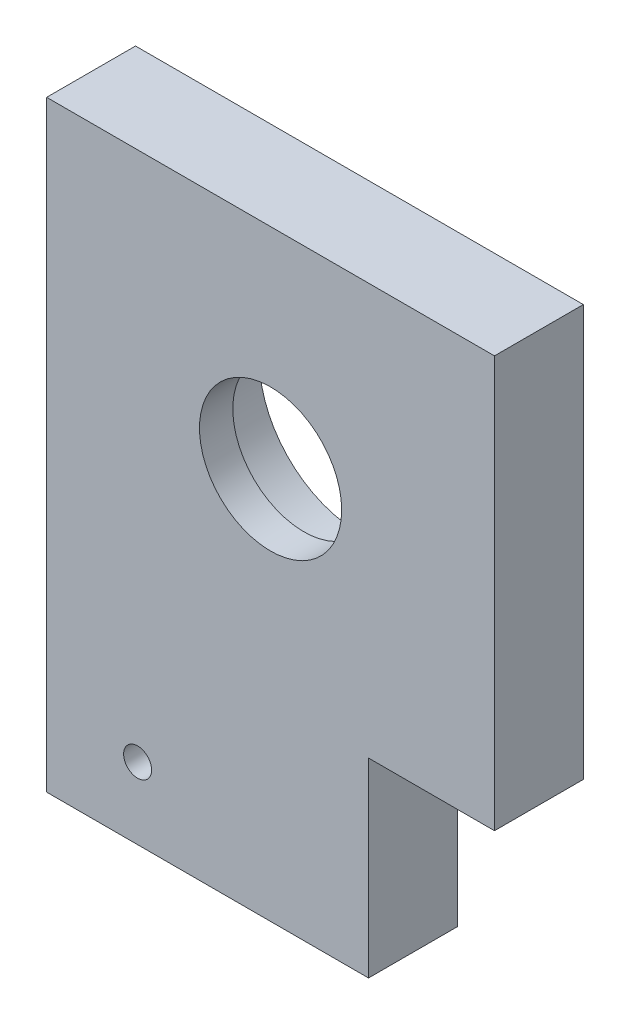
ISO-10303-21;
HEADER;
FILE_DESCRIPTION(('STEP AP214'),'2;1');
FILE_NAME('part.step','',(''),(''),'','','');
FILE_SCHEMA(('AUTOMOTIVE_DESIGN { 1 0 10303 214 1 1 1 1 }'));
ENDSEC;
DATA;
#1=APPLICATION_CONTEXT('core data for automotive mechanical design processes');
#2=APPLICATION_PROTOCOL_DEFINITION('international standard','automotive_design',2000,#1);
#3=PRODUCT_CONTEXT('',#1,'mechanical');
#4=PRODUCT('Part','Part','',(#3));
#5=PRODUCT_RELATED_PRODUCT_CATEGORY('part','',(#4));
#6=PRODUCT_DEFINITION_FORMATION('','',#4);
#7=PRODUCT_DEFINITION_CONTEXT('part definition',#1,'design');
#8=PRODUCT_DEFINITION('design','',#6,#7);
#9=PRODUCT_DEFINITION_SHAPE('','',#8);
#10=(LENGTH_UNIT() NAMED_UNIT(*) SI_UNIT(.MILLI.,.METRE.));
#11=(NAMED_UNIT(*) PLANE_ANGLE_UNIT() SI_UNIT($,.RADIAN.));
#12=(NAMED_UNIT(*) SI_UNIT($,.STERADIAN.) SOLID_ANGLE_UNIT());
#13=UNCERTAINTY_MEASURE_WITH_UNIT(LENGTH_MEASURE(1.E-05),#10,'distance_accuracy_value','');
#14=(GEOMETRIC_REPRESENTATION_CONTEXT(3) GLOBAL_UNCERTAINTY_ASSIGNED_CONTEXT((#13)) GLOBAL_UNIT_ASSIGNED_CONTEXT((#10,
#11,#12)) REPRESENTATION_CONTEXT('',''));
#15=CARTESIAN_POINT('',(0.,0.,0.));
#16=DIRECTION('',(0.,0.,1.));
#17=DIRECTION('',(1.,0.,0.));
#18=AXIS2_PLACEMENT_3D('',#15,#16,#17);
#19=CARTESIAN_POINT('',(0.,0.,12.7));
#20=DIRECTION('',(0.,0.,1.));
#21=DIRECTION('',(1.,0.,0.));
#22=AXIS2_PLACEMENT_3D('',#19,#20,#21);
#23=PLANE('',#22);
#24=CARTESIAN_POINT('',(0.,0.,12.7));
#25=DIRECTION('',(0.,0.,1.));
#26=DIRECTION('',(1.,0.,0.));
#27=AXIS2_PLACEMENT_3D('',#24,#25,#26);
#28=CIRCLE('',#27,10.16);
#29=CARTESIAN_POINT('',(10.16,0.,12.7));
#30=VERTEX_POINT('',#29);
#31=EDGE_CURVE('E121',#30,#30,#28,.T.);
#32=ORIENTED_EDGE('',*,*,#31,.F.);
#33=EDGE_LOOP('',(#32));
#34=FACE_BOUND('',#33,.T.);
#35=DIRECTION('',(1.,0.,0.));
#36=VECTOR('',#35,1.);
#37=CARTESIAN_POINT('',(14.,-28.7749891398763,12.7));
#38=LINE('',#37,#36);
#39=CARTESIAN_POINT('',(14.,-28.7749891398763,12.7));
#40=VERTEX_POINT('',#39);
#41=CARTESIAN_POINT('',(32.,-28.7749891398763,12.7));
#42=VERTEX_POINT('',#41);
#43=EDGE_CURVE('E129',#40,#42,#38,.T.);
#44=ORIENTED_EDGE('',*,*,#43,.T.);
#45=DIRECTION('',(0.,1.,0.));
#46=VECTOR('',#45,1.);
#47=CARTESIAN_POINT('',(32.,-28.7749891398763,12.7));
#48=LINE('',#47,#46);
#49=CARTESIAN_POINT('',(32.,30.,12.7));
#50=VERTEX_POINT('',#49);
#51=EDGE_CURVE('E87',#42,#50,#48,.T.);
#52=ORIENTED_EDGE('',*,*,#51,.T.);
#53=DIRECTION('',(-1.,0.,0.));
#54=VECTOR('',#53,1.);
#55=CARTESIAN_POINT('',(32.,30.,12.7));
#56=LINE('',#55,#54);
#57=CARTESIAN_POINT('',(-32.,30.,12.7));
#58=VERTEX_POINT('',#57);
#59=EDGE_CURVE('E100',#50,#58,#56,.T.);
#60=ORIENTED_EDGE('',*,*,#59,.T.);
#61=DIRECTION('',(0.,-1.,0.));
#62=VECTOR('',#61,1.);
#63=CARTESIAN_POINT('',(-32.,30.,12.7));
#64=LINE('',#63,#62);
#65=CARTESIAN_POINT('',(-32.,-56.,12.7));
#66=VERTEX_POINT('',#65);
#67=EDGE_CURVE('E94',#58,#66,#64,.T.);
#68=ORIENTED_EDGE('',*,*,#67,.T.);
#69=DIRECTION('',(1.,0.,0.));
#70=VECTOR('',#69,1.);
#71=CARTESIAN_POINT('',(14.,-56.,12.7));
#72=LINE('',#71,#70);
#73=CARTESIAN_POINT('',(14.,-56.,12.7));
#74=VERTEX_POINT('',#73);
#75=EDGE_CURVE('E98',#66,#74,#72,.T.);
#76=ORIENTED_EDGE('',*,*,#75,.T.);
#77=DIRECTION('',(0.,1.,0.));
#78=VECTOR('',#77,1.);
#79=CARTESIAN_POINT('',(14.,-56.,12.7));
#80=LINE('',#79,#78);
#81=EDGE_CURVE('E50',#74,#40,#80,.T.);
#82=ORIENTED_EDGE('',*,*,#81,.T.);
#83=EDGE_LOOP('',(#44,#52,#60,#68,#76,#82));
#84=FACE_BOUND('',#83,.T.);
#85=CARTESIAN_POINT('',(-19.,-45.7749891398763,12.7));
#86=DIRECTION('',(0.,0.,1.));
#87=DIRECTION('',(1.,0.,0.));
#88=AXIS2_PLACEMENT_3D('',#85,#86,#87);
#89=CIRCLE('',#88,2.);
#90=CARTESIAN_POINT('',(-17.,-45.7749891398763,12.7));
#91=VERTEX_POINT('',#90);
#92=EDGE_CURVE('E190',#91,#91,#89,.T.);
#93=ORIENTED_EDGE('',*,*,#92,.F.);
#94=EDGE_LOOP('',(#93));
#95=FACE_BOUND('',#94,.T.);
#96=ADVANCED_FACE('F32',(#34,#84,#95),#23,.T.);
#97=CARTESIAN_POINT('',(0.,0.,0.));
#98=DIRECTION('',(0.,0.,1.));
#99=DIRECTION('',(1.,0.,0.));
#100=AXIS2_PLACEMENT_3D('',#97,#98,#99);
#101=PLANE('',#100);
#102=CARTESIAN_POINT('',(0.,0.,0.));
#103=DIRECTION('',(0.,0.,1.));
#104=DIRECTION('',(1.,0.,0.));
#105=AXIS2_PLACEMENT_3D('',#102,#103,#104);
#106=CIRCLE('',#105,14.2875);
#107=CARTESIAN_POINT('',(14.2875,0.,0.));
#108=VERTEX_POINT('',#107);
#109=EDGE_CURVE('E184',#108,#108,#106,.T.);
#110=ORIENTED_EDGE('',*,*,#109,.T.);
#111=EDGE_LOOP('',(#110));
#112=FACE_BOUND('',#111,.T.);
#113=DIRECTION('',(1.,0.,0.));
#114=VECTOR('',#113,1.);
#115=CARTESIAN_POINT('',(14.,-28.7749891398763,0.));
#116=LINE('',#115,#114);
#117=CARTESIAN_POINT('',(14.,-28.7749891398763,0.));
#118=VERTEX_POINT('',#117);
#119=CARTESIAN_POINT('',(32.,-28.7749891398763,0.));
#120=VERTEX_POINT('',#119);
#121=EDGE_CURVE('E117',#118,#120,#116,.T.);
#122=ORIENTED_EDGE('',*,*,#121,.F.);
#123=DIRECTION('',(0.,1.,0.));
#124=VECTOR('',#123,1.);
#125=CARTESIAN_POINT('',(14.,-56.,0.));
#126=LINE('',#125,#124);
#127=CARTESIAN_POINT('',(14.,-56.,0.));
#128=VERTEX_POINT('',#127);
#129=EDGE_CURVE('E79',#128,#118,#126,.T.);
#130=ORIENTED_EDGE('',*,*,#129,.F.);
#131=DIRECTION('',(1.,0.,0.));
#132=VECTOR('',#131,1.);
#133=CARTESIAN_POINT('',(14.,-56.,0.));
#134=LINE('',#133,#132);
#135=CARTESIAN_POINT('',(-32.,-56.,0.));
#136=VERTEX_POINT('',#135);
#137=EDGE_CURVE('E73',#136,#128,#134,.T.);
#138=ORIENTED_EDGE('',*,*,#137,.F.);
#139=DIRECTION('',(0.,-1.,0.));
#140=VECTOR('',#139,1.);
#141=CARTESIAN_POINT('',(-32.,-56.,0.));
#142=LINE('',#141,#140);
#143=CARTESIAN_POINT('',(-32.,30.,0.));
#144=VERTEX_POINT('',#143);
#145=EDGE_CURVE('E107',#144,#136,#142,.T.);
#146=ORIENTED_EDGE('',*,*,#145,.F.);
#147=DIRECTION('',(-1.,0.,0.));
#148=VECTOR('',#147,1.);
#149=CARTESIAN_POINT('',(32.,30.,0.));
#150=LINE('',#149,#148);
#151=CARTESIAN_POINT('',(32.,30.,0.));
#152=VERTEX_POINT('',#151);
#153=EDGE_CURVE('E123',#152,#144,#150,.T.);
#154=ORIENTED_EDGE('',*,*,#153,.F.);
#155=DIRECTION('',(0.,1.,0.));
#156=VECTOR('',#155,1.);
#157=CARTESIAN_POINT('',(32.,-28.7749891398763,0.));
#158=LINE('',#157,#156);
#159=EDGE_CURVE('E120',#120,#152,#158,.T.);
#160=ORIENTED_EDGE('',*,*,#159,.F.);
#161=EDGE_LOOP('',(#122,#130,#138,#146,#154,#160));
#162=FACE_BOUND('',#161,.T.);
#163=CARTESIAN_POINT('',(-19.,-45.7749891398763,0.));
#164=DIRECTION('',(0.,0.,1.));
#165=DIRECTION('',(1.,0.,0.));
#166=AXIS2_PLACEMENT_3D('',#163,#164,#165);
#167=CIRCLE('',#166,2.);
#168=CARTESIAN_POINT('',(-17.,-45.7749891398763,0.));
#169=VERTEX_POINT('',#168);
#170=EDGE_CURVE('E186',#169,#169,#167,.T.);
#171=ORIENTED_EDGE('',*,*,#170,.T.);
#172=EDGE_LOOP('',(#171));
#173=FACE_BOUND('',#172,.T.);
#174=ADVANCED_FACE('F139',(#112,#162,#173),#101,.F.);
#175=CARTESIAN_POINT('',(14.,-28.7749891398763,12.7));
#176=DIRECTION('',(0.,1.,0.));
#177=DIRECTION('',(0.,0.,1.));
#178=AXIS2_PLACEMENT_3D('',#175,#176,#177);
#179=PLANE('',#178);
#180=ORIENTED_EDGE('',*,*,#121,.T.);
#181=DIRECTION('',(0.,0.,-1.));
#182=VECTOR('',#181,1.);
#183=CARTESIAN_POINT('',(32.,-28.7749891398763,12.7));
#184=LINE('',#183,#182);
#185=EDGE_CURVE('E11',#42,#120,#184,.T.);
#186=ORIENTED_EDGE('',*,*,#185,.F.);
#187=ORIENTED_EDGE('',*,*,#43,.F.);
#188=DIRECTION('',(0.,0.,-1.));
#189=VECTOR('',#188,1.);
#190=CARTESIAN_POINT('',(14.,-28.7749891398763,12.7));
#191=LINE('',#190,#189);
#192=EDGE_CURVE('E113',#40,#118,#191,.T.);
#193=ORIENTED_EDGE('',*,*,#192,.T.);
#194=EDGE_LOOP('',(#180,#186,#187,#193));
#195=FACE_BOUND('',#194,.T.);
#196=ADVANCED_FACE('F34',(#195),#179,.F.);
#197=CARTESIAN_POINT('',(32.,-28.7749891398763,12.7));
#198=DIRECTION('',(-1.,0.,0.));
#199=DIRECTION('',(0.,-1.,0.));
#200=AXIS2_PLACEMENT_3D('',#197,#198,#199);
#201=PLANE('',#200);
#202=ORIENTED_EDGE('',*,*,#159,.T.);
#203=DIRECTION('',(0.,0.,-1.));
#204=VECTOR('',#203,1.);
#205=CARTESIAN_POINT('',(32.,30.,12.7));
#206=LINE('',#205,#204);
#207=EDGE_CURVE('E42',#50,#152,#206,.T.);
#208=ORIENTED_EDGE('',*,*,#207,.F.);
#209=ORIENTED_EDGE('',*,*,#51,.F.);
#210=ORIENTED_EDGE('',*,*,#185,.T.);
#211=EDGE_LOOP('',(#202,#208,#209,#210));
#212=FACE_BOUND('',#211,.T.);
#213=ADVANCED_FACE('F233',(#212),#201,.F.);
#214=CARTESIAN_POINT('',(32.,30.,12.7));
#215=DIRECTION('',(0.,-1.,0.));
#216=DIRECTION('',(1.,0.,0.));
#217=AXIS2_PLACEMENT_3D('',#214,#215,#216);
#218=PLANE('',#217);
#219=ORIENTED_EDGE('',*,*,#153,.T.);
#220=DIRECTION('',(0.,0.,-1.));
#221=VECTOR('',#220,1.);
#222=CARTESIAN_POINT('',(-32.,30.,12.7));
#223=LINE('',#222,#221);
#224=EDGE_CURVE('E108',#58,#144,#223,.T.);
#225=ORIENTED_EDGE('',*,*,#224,.F.);
#226=ORIENTED_EDGE('',*,*,#59,.F.);
#227=ORIENTED_EDGE('',*,*,#207,.T.);
#228=EDGE_LOOP('',(#219,#225,#226,#227));
#229=FACE_BOUND('',#228,.T.);
#230=ADVANCED_FACE('F136',(#229),#218,.F.);
#231=CARTESIAN_POINT('',(-32.,-56.,12.7));
#232=DIRECTION('',(1.,0.,0.));
#233=DIRECTION('',(0.,1.,0.));
#234=AXIS2_PLACEMENT_3D('',#231,#232,#233);
#235=PLANE('',#234);
#236=ORIENTED_EDGE('',*,*,#145,.T.);
#237=DIRECTION('',(0.,0.,-1.));
#238=VECTOR('',#237,1.);
#239=CARTESIAN_POINT('',(-32.,-56.,12.7));
#240=LINE('',#239,#238);
#241=EDGE_CURVE('E105',#66,#136,#240,.T.);
#242=ORIENTED_EDGE('',*,*,#241,.F.);
#243=ORIENTED_EDGE('',*,*,#67,.F.);
#244=ORIENTED_EDGE('',*,*,#224,.T.);
#245=EDGE_LOOP('',(#236,#242,#243,#244));
#246=FACE_BOUND('',#245,.T.);
#247=ADVANCED_FACE('F106',(#246),#235,.F.);
#248=CARTESIAN_POINT('',(14.,-56.,12.7));
#249=DIRECTION('',(0.,1.,0.));
#250=DIRECTION('',(-1.,0.,0.));
#251=AXIS2_PLACEMENT_3D('',#248,#249,#250);
#252=PLANE('',#251);
#253=ORIENTED_EDGE('',*,*,#137,.T.);
#254=DIRECTION('',(0.,0.,-1.));
#255=VECTOR('',#254,1.);
#256=CARTESIAN_POINT('',(14.,-56.,12.7));
#257=LINE('',#256,#255);
#258=EDGE_CURVE('E109',#74,#128,#257,.T.);
#259=ORIENTED_EDGE('',*,*,#258,.F.);
#260=ORIENTED_EDGE('',*,*,#75,.F.);
#261=ORIENTED_EDGE('',*,*,#241,.T.);
#262=EDGE_LOOP('',(#253,#259,#260,#261));
#263=FACE_BOUND('',#262,.T.);
#264=ADVANCED_FACE('F111',(#263),#252,.F.);
#265=CARTESIAN_POINT('',(14.,-56.,12.7));
#266=DIRECTION('',(-1.,0.,0.));
#267=DIRECTION('',(0.,0.,1.));
#268=AXIS2_PLACEMENT_3D('',#265,#266,#267);
#269=PLANE('',#268);
#270=ORIENTED_EDGE('',*,*,#129,.T.);
#271=ORIENTED_EDGE('',*,*,#192,.F.);
#272=ORIENTED_EDGE('',*,*,#81,.F.);
#273=ORIENTED_EDGE('',*,*,#258,.T.);
#274=EDGE_LOOP('',(#270,#271,#272,#273));
#275=FACE_BOUND('',#274,.T.);
#276=ADVANCED_FACE('F144',(#275),#269,.F.);
#277=CARTESIAN_POINT('',(0.,0.,12.7));
#278=DIRECTION('',(0.,0.,-1.));
#279=DIRECTION('',(-1.,0.,0.));
#280=AXIS2_PLACEMENT_3D('',#277,#278,#279);
#281=CYLINDRICAL_SURFACE('',#280,10.16);
#282=CARTESIAN_POINT('',(0.,0.,7.9375));
#283=DIRECTION('',(0.,0.,1.));
#284=DIRECTION('',(1.,0.,0.));
#285=AXIS2_PLACEMENT_3D('',#282,#283,#284);
#286=CIRCLE('',#285,10.16);
#287=CARTESIAN_POINT('',(10.16,0.,7.9375));
#288=VERTEX_POINT('',#287);
#289=EDGE_CURVE('E36',#288,#288,#286,.T.);
#290=ORIENTED_EDGE('',*,*,#289,.F.);
#291=EDGE_LOOP('',(#290));
#292=FACE_BOUND('',#291,.T.);
#293=ORIENTED_EDGE('',*,*,#31,.T.);
#294=EDGE_LOOP('',(#293));
#295=FACE_BOUND('',#294,.T.);
#296=ADVANCED_FACE('F146',(#292,#295),#281,.F.);
#297=CARTESIAN_POINT('',(-19.,-45.7749891398763,12.7));
#298=DIRECTION('',(0.,0.,-1.));
#299=DIRECTION('',(-1.,0.,0.));
#300=AXIS2_PLACEMENT_3D('',#297,#298,#299);
#301=CYLINDRICAL_SURFACE('',#300,2.);
#302=ORIENTED_EDGE('',*,*,#92,.T.);
#303=EDGE_LOOP('',(#302));
#304=FACE_BOUND('',#303,.T.);
#305=ORIENTED_EDGE('',*,*,#170,.F.);
#306=EDGE_LOOP('',(#305));
#307=FACE_BOUND('',#306,.T.);
#308=ADVANCED_FACE('F152',(#304,#307),#301,.F.);
#309=CARTESIAN_POINT('',(0.,0.,7.9375));
#310=DIRECTION('',(0.,0.,-1.));
#311=DIRECTION('',(-1.,0.,0.));
#312=AXIS2_PLACEMENT_3D('',#309,#310,#311);
#313=CYLINDRICAL_SURFACE('',#312,14.2875);
#314=CARTESIAN_POINT('',(0.,0.,7.9375));
#315=DIRECTION('',(0.,0.,1.));
#316=DIRECTION('',(1.,0.,0.));
#317=AXIS2_PLACEMENT_3D('',#314,#315,#316);
#318=CIRCLE('',#317,14.2875);
#319=CARTESIAN_POINT('',(14.2875,0.,7.9375));
#320=VERTEX_POINT('',#319);
#321=EDGE_CURVE('E183',#320,#320,#318,.T.);
#322=ORIENTED_EDGE('',*,*,#321,.T.);
#323=EDGE_LOOP('',(#322));
#324=FACE_BOUND('',#323,.T.);
#325=ORIENTED_EDGE('',*,*,#109,.F.);
#326=EDGE_LOOP('',(#325));
#327=FACE_BOUND('',#326,.T.);
#328=ADVANCED_FACE('F168',(#324,#327),#313,.F.);
#329=CARTESIAN_POINT('',(0.,0.,7.9375));
#330=DIRECTION('',(0.,0.,1.));
#331=DIRECTION('',(1.,0.,0.));
#332=AXIS2_PLACEMENT_3D('',#329,#330,#331);
#333=PLANE('',#332);
#334=ORIENTED_EDGE('',*,*,#289,.T.);
#335=EDGE_LOOP('',(#334));
#336=FACE_BOUND('',#335,.T.);
#337=ORIENTED_EDGE('',*,*,#321,.F.);
#338=EDGE_LOOP('',(#337));
#339=FACE_BOUND('',#338,.T.);
#340=ADVANCED_FACE('F172',(#336,#339),#333,.F.);
#341=CLOSED_SHELL('',(#96,#174,#196,#213,#230,#247,#264,#276,#296,#308,#328,#340));
#342=MANIFOLD_SOLID_BREP('B2',#341);
#343=ADVANCED_BREP_SHAPE_REPRESENTATION('',(#18,#342),#14);
#344=SHAPE_DEFINITION_REPRESENTATION(#9,#343);
ENDSEC;
END-ISO-10303-21;
